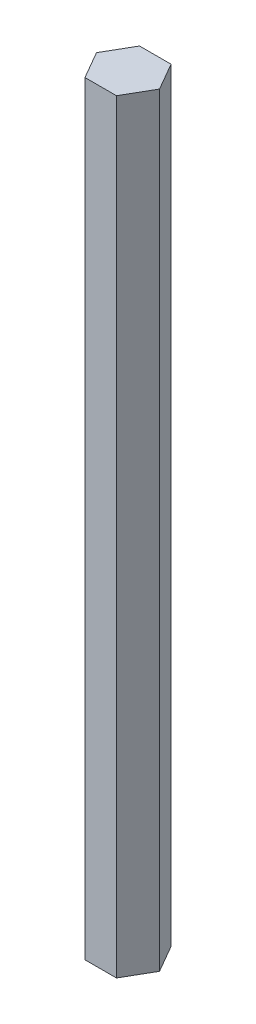
ISO-10303-21;
HEADER;
FILE_DESCRIPTION(('STEP AP214'),'2;1');
FILE_NAME('part.step','',(''),(''),'','','');
FILE_SCHEMA(('AUTOMOTIVE_DESIGN { 1 0 10303 214 1 1 1 1 }'));
ENDSEC;
DATA;
#1=APPLICATION_CONTEXT('core data for automotive mechanical design processes');
#2=APPLICATION_PROTOCOL_DEFINITION('international standard','automotive_design',2000,#1);
#3=PRODUCT_CONTEXT('',#1,'mechanical');
#4=PRODUCT('Part','Part','',(#3));
#5=PRODUCT_RELATED_PRODUCT_CATEGORY('part','',(#4));
#6=PRODUCT_DEFINITION_FORMATION('','',#4);
#7=PRODUCT_DEFINITION_CONTEXT('part definition',#1,'design');
#8=PRODUCT_DEFINITION('design','',#6,#7);
#9=PRODUCT_DEFINITION_SHAPE('','',#8);
#10=(LENGTH_UNIT() NAMED_UNIT(*) SI_UNIT(.MILLI.,.METRE.));
#11=(NAMED_UNIT(*) PLANE_ANGLE_UNIT() SI_UNIT($,.RADIAN.));
#12=(NAMED_UNIT(*) SI_UNIT($,.STERADIAN.) SOLID_ANGLE_UNIT());
#13=UNCERTAINTY_MEASURE_WITH_UNIT(LENGTH_MEASURE(1.E-05),#10,'distance_accuracy_value','');
#14=(GEOMETRIC_REPRESENTATION_CONTEXT(3) GLOBAL_UNCERTAINTY_ASSIGNED_CONTEXT((#13)) GLOBAL_UNIT_ASSIGNED_CONTEXT((#10,
#11,#12)) REPRESENTATION_CONTEXT('',''));
#15=CARTESIAN_POINT('',(0.,0.,0.));
#16=DIRECTION('',(0.,0.,1.));
#17=DIRECTION('',(1.,0.,0.));
#18=AXIS2_PLACEMENT_3D('',#15,#16,#17);
#19=CARTESIAN_POINT('',(7.33234841870824,177.8,0.));
#20=DIRECTION('',(-0.866025403784439,0.,0.5));
#21=DIRECTION('',(0.5,0.,0.866025403784439));
#22=AXIS2_PLACEMENT_3D('',#19,#20,#21);
#23=PLANE('',#22);
#24=DIRECTION('',(-0.5,0.,-0.866025403784439));
#25=VECTOR('',#24,1.);
#26=CARTESIAN_POINT('',(7.33234841870824,0.,0.));
#27=LINE('',#26,#25);
#28=CARTESIAN_POINT('',(7.33234841870824,0.,0.));
#29=VERTEX_POINT('',#28);
#30=CARTESIAN_POINT('',(3.66617420935411,0.,-6.35000000000002));
#31=VERTEX_POINT('',#30);
#32=EDGE_CURVE('E117',#29,#31,#27,.T.);
#33=ORIENTED_EDGE('',*,*,#32,.T.);
#34=DIRECTION('',(0.,-1.,0.));
#35=VECTOR('',#34,1.);
#36=CARTESIAN_POINT('',(3.66617420935411,177.8,-6.35000000000002));
#37=LINE('',#36,#35);
#38=CARTESIAN_POINT('',(3.66617420935411,177.8,-6.35000000000002));
#39=VERTEX_POINT('',#38);
#40=EDGE_CURVE('E11',#39,#31,#37,.T.);
#41=ORIENTED_EDGE('',*,*,#40,.F.);
#42=DIRECTION('',(-0.5,0.,-0.866025403784439));
#43=VECTOR('',#42,1.);
#44=CARTESIAN_POINT('',(7.33234841870824,177.8,0.));
#45=LINE('',#44,#43);
#46=CARTESIAN_POINT('',(7.33234841870824,177.8,0.));
#47=VERTEX_POINT('',#46);
#48=EDGE_CURVE('E127',#47,#39,#45,.T.);
#49=ORIENTED_EDGE('',*,*,#48,.F.);
#50=DIRECTION('',(0.,-1.,0.));
#51=VECTOR('',#50,1.);
#52=CARTESIAN_POINT('',(7.33234841870824,177.8,0.));
#53=LINE('',#52,#51);
#54=EDGE_CURVE('E113',#47,#29,#53,.T.);
#55=ORIENTED_EDGE('',*,*,#54,.T.);
#56=EDGE_LOOP('',(#33,#41,#49,#55));
#57=FACE_BOUND('',#56,.T.);
#58=ADVANCED_FACE('F33',(#57),#23,.F.);
#59=CARTESIAN_POINT('',(3.66617420935411,177.8,-6.35000000000002));
#60=DIRECTION('',(0.,0.,1.));
#61=DIRECTION('',(1.,0.,0.));
#62=AXIS2_PLACEMENT_3D('',#59,#60,#61);
#63=PLANE('',#62);
#64=DIRECTION('',(-1.,0.,0.));
#65=VECTOR('',#64,1.);
#66=CARTESIAN_POINT('',(3.66617420935411,0.,-6.35000000000002));
#67=LINE('',#66,#65);
#68=CARTESIAN_POINT('',(-3.66617420935413,0.,-6.35000000000002));
#69=VERTEX_POINT('',#68);
#70=EDGE_CURVE('E120',#31,#69,#67,.T.);
#71=ORIENTED_EDGE('',*,*,#70,.T.);
#72=DIRECTION('',(0.,-1.,0.));
#73=VECTOR('',#72,1.);
#74=CARTESIAN_POINT('',(-3.66617420935413,177.8,-6.35000000000002));
#75=LINE('',#74,#73);
#76=CARTESIAN_POINT('',(-3.66617420935413,177.8,-6.35000000000002));
#77=VERTEX_POINT('',#76);
#78=EDGE_CURVE('E41',#77,#69,#75,.T.);
#79=ORIENTED_EDGE('',*,*,#78,.F.);
#80=DIRECTION('',(-1.,0.,0.));
#81=VECTOR('',#80,1.);
#82=CARTESIAN_POINT('',(3.66617420935411,177.8,-6.35000000000002));
#83=LINE('',#82,#81);
#84=EDGE_CURVE('E86',#39,#77,#83,.T.);
#85=ORIENTED_EDGE('',*,*,#84,.F.);
#86=ORIENTED_EDGE('',*,*,#40,.T.);
#87=EDGE_LOOP('',(#71,#79,#85,#86));
#88=FACE_BOUND('',#87,.T.);
#89=ADVANCED_FACE('F151',(#88),#63,.F.);
#90=CARTESIAN_POINT('',(-3.66617420935413,177.8,-6.35000000000002));
#91=DIRECTION('',(0.866025403784439,0.,0.5));
#92=DIRECTION('',(0.5,0.,-0.866025403784439));
#93=AXIS2_PLACEMENT_3D('',#90,#91,#92);
#94=PLANE('',#93);
#95=DIRECTION('',(-0.5,0.,0.866025403784439));
#96=VECTOR('',#95,1.);
#97=CARTESIAN_POINT('',(-3.66617420935413,0.,-6.35000000000002));
#98=LINE('',#97,#96);
#99=CARTESIAN_POINT('',(-7.33234841870826,0.,0.));
#100=VERTEX_POINT('',#99);
#101=EDGE_CURVE('E122',#69,#100,#98,.T.);
#102=ORIENTED_EDGE('',*,*,#101,.T.);
#103=DIRECTION('',(0.,-1.,0.));
#104=VECTOR('',#103,1.);
#105=CARTESIAN_POINT('',(-7.33234841870826,177.8,0.));
#106=LINE('',#105,#104);
#107=CARTESIAN_POINT('',(-7.33234841870826,177.8,0.));
#108=VERTEX_POINT('',#107);
#109=EDGE_CURVE('E108',#108,#100,#106,.T.);
#110=ORIENTED_EDGE('',*,*,#109,.F.);
#111=DIRECTION('',(-0.5,0.,0.866025403784439));
#112=VECTOR('',#111,1.);
#113=CARTESIAN_POINT('',(-3.66617420935413,177.8,-6.35000000000002));
#114=LINE('',#113,#112);
#115=EDGE_CURVE('E99',#77,#108,#114,.T.);
#116=ORIENTED_EDGE('',*,*,#115,.F.);
#117=ORIENTED_EDGE('',*,*,#78,.T.);
#118=EDGE_LOOP('',(#102,#110,#116,#117));
#119=FACE_BOUND('',#118,.T.);
#120=ADVANCED_FACE('F133',(#119),#94,.F.);
#121=CARTESIAN_POINT('',(-7.33234841870826,177.8,0.));
#122=DIRECTION('',(0.866025403784439,0.,-0.5));
#123=DIRECTION('',(-0.5,0.,-0.866025403784439));
#124=AXIS2_PLACEMENT_3D('',#121,#122,#123);
#125=PLANE('',#124);
#126=DIRECTION('',(0.5,0.,0.866025403784439));
#127=VECTOR('',#126,1.);
#128=CARTESIAN_POINT('',(-7.33234841870826,0.,0.));
#129=LINE('',#128,#127);
#130=CARTESIAN_POINT('',(-3.66617420935413,0.,6.35000000000001));
#131=VERTEX_POINT('',#130);
#132=EDGE_CURVE('E107',#100,#131,#129,.T.);
#133=ORIENTED_EDGE('',*,*,#132,.T.);
#134=DIRECTION('',(0.,-1.,0.));
#135=VECTOR('',#134,1.);
#136=CARTESIAN_POINT('',(-3.66617420935413,177.8,6.35000000000001));
#137=LINE('',#136,#135);
#138=CARTESIAN_POINT('',(-3.66617420935413,177.8,6.35000000000001));
#139=VERTEX_POINT('',#138);
#140=EDGE_CURVE('E104',#139,#131,#137,.T.);
#141=ORIENTED_EDGE('',*,*,#140,.F.);
#142=DIRECTION('',(0.5,0.,0.866025403784439));
#143=VECTOR('',#142,1.);
#144=CARTESIAN_POINT('',(-7.33234841870826,177.8,0.));
#145=LINE('',#144,#143);
#146=EDGE_CURVE('E93',#108,#139,#145,.T.);
#147=ORIENTED_EDGE('',*,*,#146,.F.);
#148=ORIENTED_EDGE('',*,*,#109,.T.);
#149=EDGE_LOOP('',(#133,#141,#147,#148));
#150=FACE_BOUND('',#149,.T.);
#151=ADVANCED_FACE('F105',(#150),#125,.F.);
#152=CARTESIAN_POINT('',(-3.66617420935413,177.8,6.35000000000001));
#153=DIRECTION('',(0.,0.,-1.));
#154=DIRECTION('',(-1.,0.,0.));
#155=AXIS2_PLACEMENT_3D('',#152,#153,#154);
#156=PLANE('',#155);
#157=DIRECTION('',(1.,0.,0.));
#158=VECTOR('',#157,1.);
#159=CARTESIAN_POINT('',(-3.66617420935413,0.,6.35000000000001));
#160=LINE('',#159,#158);
#161=CARTESIAN_POINT('',(3.66617420935412,0.,6.35000000000001));
#162=VERTEX_POINT('',#161);
#163=EDGE_CURVE('E72',#131,#162,#160,.T.);
#164=ORIENTED_EDGE('',*,*,#163,.T.);
#165=DIRECTION('',(0.,-1.,0.));
#166=VECTOR('',#165,1.);
#167=CARTESIAN_POINT('',(3.66617420935412,177.8,6.35000000000001));
#168=LINE('',#167,#166);
#169=CARTESIAN_POINT('',(3.66617420935412,177.8,6.35000000000001));
#170=VERTEX_POINT('',#169);
#171=EDGE_CURVE('E109',#170,#162,#168,.T.);
#172=ORIENTED_EDGE('',*,*,#171,.F.);
#173=DIRECTION('',(1.,0.,0.));
#174=VECTOR('',#173,1.);
#175=CARTESIAN_POINT('',(-3.66617420935413,177.8,6.35000000000001));
#176=LINE('',#175,#174);
#177=EDGE_CURVE('E97',#139,#170,#176,.T.);
#178=ORIENTED_EDGE('',*,*,#177,.F.);
#179=ORIENTED_EDGE('',*,*,#140,.T.);
#180=EDGE_LOOP('',(#164,#172,#178,#179));
#181=FACE_BOUND('',#180,.T.);
#182=ADVANCED_FACE('F111',(#181),#156,.F.);
#183=CARTESIAN_POINT('',(3.66617420935412,177.8,6.35000000000001));
#184=DIRECTION('',(-0.866025403784439,0.,-0.5));
#185=DIRECTION('',(-0.5,0.,0.866025403784439));
#186=AXIS2_PLACEMENT_3D('',#183,#184,#185);
#187=PLANE('',#186);
#188=DIRECTION('',(0.5,0.,-0.866025403784439));
#189=VECTOR('',#188,1.);
#190=CARTESIAN_POINT('',(3.66617420935412,0.,6.35000000000001));
#191=LINE('',#190,#189);
#192=EDGE_CURVE('E78',#162,#29,#191,.T.);
#193=ORIENTED_EDGE('',*,*,#192,.T.);
#194=ORIENTED_EDGE('',*,*,#54,.F.);
#195=DIRECTION('',(0.5,0.,-0.866025403784439));
#196=VECTOR('',#195,1.);
#197=CARTESIAN_POINT('',(3.66617420935412,177.8,6.35000000000001));
#198=LINE('',#197,#196);
#199=EDGE_CURVE('E49',#170,#47,#198,.T.);
#200=ORIENTED_EDGE('',*,*,#199,.F.);
#201=ORIENTED_EDGE('',*,*,#171,.T.);
#202=EDGE_LOOP('',(#193,#194,#200,#201));
#203=FACE_BOUND('',#202,.T.);
#204=ADVANCED_FACE('F140',(#203),#187,.F.);
#205=CARTESIAN_POINT('',(0.,177.8,0.));
#206=DIRECTION('',(0.,1.,0.));
#207=DIRECTION('',(0.,0.,1.));
#208=AXIS2_PLACEMENT_3D('',#205,#206,#207);
#209=PLANE('',#208);
#210=ORIENTED_EDGE('',*,*,#48,.T.);
#211=ORIENTED_EDGE('',*,*,#84,.T.);
#212=ORIENTED_EDGE('',*,*,#115,.T.);
#213=ORIENTED_EDGE('',*,*,#146,.T.);
#214=ORIENTED_EDGE('',*,*,#177,.T.);
#215=ORIENTED_EDGE('',*,*,#199,.T.);
#216=EDGE_LOOP('',(#210,#211,#212,#213,#214,#215));
#217=FACE_BOUND('',#216,.T.);
#218=ADVANCED_FACE('F95',(#217),#209,.T.);
#219=CARTESIAN_POINT('',(0.,0.,0.));
#220=DIRECTION('',(0.,1.,0.));
#221=DIRECTION('',(0.,0.,1.));
#222=AXIS2_PLACEMENT_3D('',#219,#220,#221);
#223=PLANE('',#222);
#224=ORIENTED_EDGE('',*,*,#32,.F.);
#225=ORIENTED_EDGE('',*,*,#192,.F.);
#226=ORIENTED_EDGE('',*,*,#163,.F.);
#227=ORIENTED_EDGE('',*,*,#132,.F.);
#228=ORIENTED_EDGE('',*,*,#101,.F.);
#229=ORIENTED_EDGE('',*,*,#70,.F.);
#230=EDGE_LOOP('',(#224,#225,#226,#227,#228,#229));
#231=FACE_BOUND('',#230,.T.);
#232=ADVANCED_FACE('F136',(#231),#223,.F.);
#233=CLOSED_SHELL('',(#58,#89,#120,#151,#182,#204,#218,#232));
#234=MANIFOLD_SOLID_BREP('B2',#233);
#235=ADVANCED_BREP_SHAPE_REPRESENTATION('',(#18,#234),#14);
#236=SHAPE_DEFINITION_REPRESENTATION(#9,#235);
ENDSEC;
END-ISO-10303-21;
